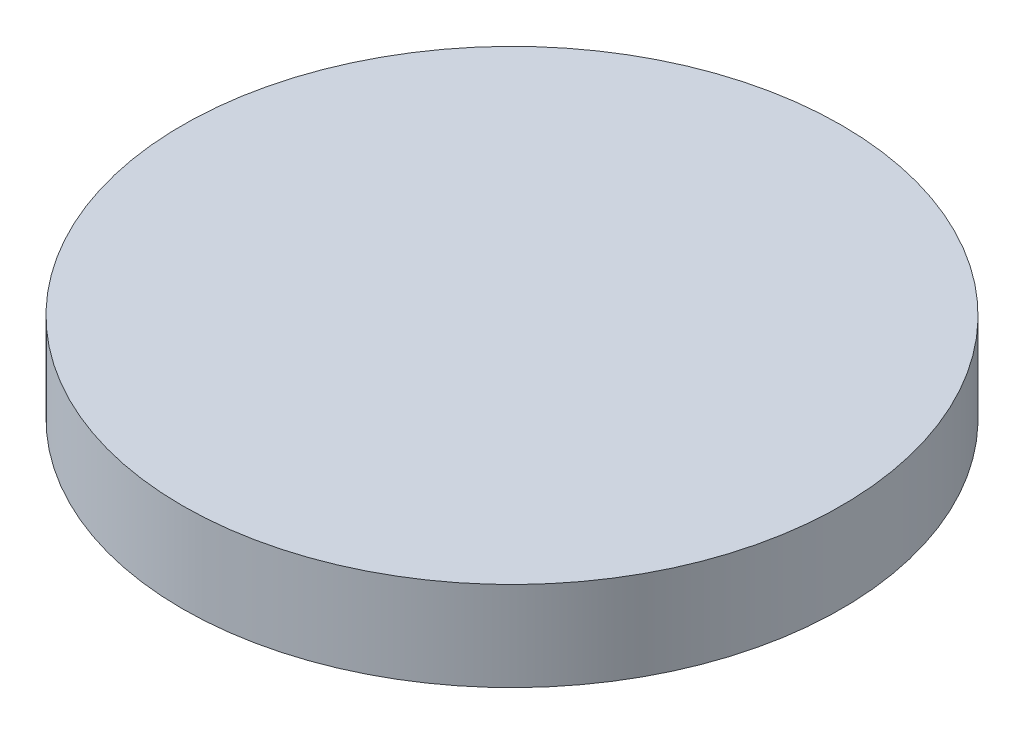
ISO-10303-21;
HEADER;
FILE_DESCRIPTION(('STEP AP214'),'2;1');
FILE_NAME('part.step','',(''),(''),'','','');
FILE_SCHEMA(('AUTOMOTIVE_DESIGN { 1 0 10303 214 1 1 1 1 }'));
ENDSEC;
DATA;
#1=APPLICATION_CONTEXT('core data for automotive mechanical design processes');
#2=APPLICATION_PROTOCOL_DEFINITION('international standard','automotive_design',2000,#1);
#3=PRODUCT_CONTEXT('',#1,'mechanical');
#4=PRODUCT('Part','Part','',(#3));
#5=PRODUCT_RELATED_PRODUCT_CATEGORY('part','',(#4));
#6=PRODUCT_DEFINITION_FORMATION('','',#4);
#7=PRODUCT_DEFINITION_CONTEXT('part definition',#1,'design');
#8=PRODUCT_DEFINITION('design','',#6,#7);
#9=PRODUCT_DEFINITION_SHAPE('','',#8);
#10=(LENGTH_UNIT() NAMED_UNIT(*) SI_UNIT(.MILLI.,.METRE.));
#11=(NAMED_UNIT(*) PLANE_ANGLE_UNIT() SI_UNIT($,.RADIAN.));
#12=(NAMED_UNIT(*) SI_UNIT($,.STERADIAN.) SOLID_ANGLE_UNIT());
#13=UNCERTAINTY_MEASURE_WITH_UNIT(LENGTH_MEASURE(1.E-05),#10,'distance_accuracy_value','');
#14=(GEOMETRIC_REPRESENTATION_CONTEXT(3) GLOBAL_UNCERTAINTY_ASSIGNED_CONTEXT((#13)) GLOBAL_UNIT_ASSIGNED_CONTEXT((#10,
#11,#12)) REPRESENTATION_CONTEXT('',''));
#15=CARTESIAN_POINT('',(0.,0.,0.));
#16=DIRECTION('',(0.,0.,1.));
#17=DIRECTION('',(1.,0.,0.));
#18=AXIS2_PLACEMENT_3D('',#15,#16,#17);
#19=CARTESIAN_POINT('',(0.,10.,0.));
#20=DIRECTION('',(0.,-1.,0.));
#21=DIRECTION('',(0.,0.,-1.));
#22=AXIS2_PLACEMENT_3D('',#19,#20,#21);
#23=CYLINDRICAL_SURFACE('',#22,36.89709041917);
#24=CARTESIAN_POINT('',(0.,10.,0.));
#25=DIRECTION('',(0.,1.,0.));
#26=DIRECTION('',(0.,0.,1.));
#27=AXIS2_PLACEMENT_3D('',#24,#25,#26);
#28=CIRCLE('',#27,36.89709041917);
#29=CARTESIAN_POINT('',(0.,10.,36.89709041917));
#30=VERTEX_POINT('',#29);
#31=EDGE_CURVE('E10',#30,#30,#28,.T.);
#32=ORIENTED_EDGE('',*,*,#31,.F.);
#33=EDGE_LOOP('',(#32));
#34=FACE_BOUND('',#33,.T.);
#35=CARTESIAN_POINT('',(0.,0.,0.));
#36=DIRECTION('',(0.,1.,0.));
#37=DIRECTION('',(0.,0.,1.));
#38=AXIS2_PLACEMENT_3D('',#35,#36,#37);
#39=CIRCLE('',#38,36.89709041917);
#40=CARTESIAN_POINT('',(0.,0.,36.89709041917));
#41=VERTEX_POINT('',#40);
#42=EDGE_CURVE('E34',#41,#41,#39,.T.);
#43=ORIENTED_EDGE('',*,*,#42,.T.);
#44=EDGE_LOOP('',(#43));
#45=FACE_BOUND('',#44,.T.);
#46=ADVANCED_FACE('F31',(#34,#45),#23,.T.);
#47=CARTESIAN_POINT('',(0.,10.,0.));
#48=DIRECTION('',(0.,1.,0.));
#49=DIRECTION('',(0.,0.,1.));
#50=AXIS2_PLACEMENT_3D('',#47,#48,#49);
#51=PLANE('',#50);
#52=ORIENTED_EDGE('',*,*,#31,.T.);
#53=EDGE_LOOP('',(#52));
#54=FACE_BOUND('',#53,.T.);
#55=ADVANCED_FACE('F62',(#54),#51,.T.);
#56=CARTESIAN_POINT('',(0.,0.,0.));
#57=DIRECTION('',(0.,1.,0.));
#58=DIRECTION('',(0.,0.,1.));
#59=AXIS2_PLACEMENT_3D('',#56,#57,#58);
#60=PLANE('',#59);
#61=CARTESIAN_POINT('',(0.,0.,0.));
#62=DIRECTION('',(0.,1.,0.));
#63=DIRECTION('',(0.,0.,1.));
#64=AXIS2_PLACEMENT_3D('',#61,#62,#63);
#65=CIRCLE('',#64,34.89709041917);
#66=CARTESIAN_POINT('',(0.,0.,34.89709041917));
#67=VERTEX_POINT('',#66);
#68=EDGE_CURVE('E43',#67,#67,#65,.T.);
#69=ORIENTED_EDGE('',*,*,#68,.T.);
#70=EDGE_LOOP('',(#69));
#71=FACE_BOUND('',#70,.T.);
#72=ORIENTED_EDGE('',*,*,#42,.F.);
#73=EDGE_LOOP('',(#72));
#74=FACE_BOUND('',#73,.T.);
#75=ADVANCED_FACE('F58',(#71,#74),#60,.F.);
#76=CARTESIAN_POINT('',(0.,10.,0.));
#77=DIRECTION('',(0.,-1.,0.));
#78=DIRECTION('',(0.,0.,-1.));
#79=AXIS2_PLACEMENT_3D('',#76,#77,#78);
#80=CYLINDRICAL_SURFACE('',#79,34.89709041917);
#81=CARTESIAN_POINT('',(0.,8.,0.));
#82=DIRECTION('',(0.,1.,0.));
#83=DIRECTION('',(0.,0.,1.));
#84=AXIS2_PLACEMENT_3D('',#81,#82,#83);
#85=CIRCLE('',#84,34.89709041917);
#86=CARTESIAN_POINT('',(0.,8.,34.89709041917));
#87=VERTEX_POINT('',#86);
#88=EDGE_CURVE('E41',#87,#87,#85,.T.);
#89=ORIENTED_EDGE('',*,*,#88,.T.);
#90=EDGE_LOOP('',(#89));
#91=FACE_BOUND('',#90,.T.);
#92=ORIENTED_EDGE('',*,*,#68,.F.);
#93=EDGE_LOOP('',(#92));
#94=FACE_BOUND('',#93,.T.);
#95=ADVANCED_FACE('F49',(#91,#94),#80,.F.);
#96=CARTESIAN_POINT('',(0.,8.,0.));
#97=DIRECTION('',(0.,1.,0.));
#98=DIRECTION('',(0.,0.,1.));
#99=AXIS2_PLACEMENT_3D('',#96,#97,#98);
#100=PLANE('',#99);
#101=ORIENTED_EDGE('',*,*,#88,.F.);
#102=EDGE_LOOP('',(#101));
#103=FACE_BOUND('',#102,.T.);
#104=ADVANCED_FACE('F52',(#103),#100,.F.);
#105=CLOSED_SHELL('',(#46,#55,#75,#95,#104));
#106=MANIFOLD_SOLID_BREP('B2',#105);
#107=ADVANCED_BREP_SHAPE_REPRESENTATION('',(#18,#106),#14);
#108=SHAPE_DEFINITION_REPRESENTATION(#9,#107);
ENDSEC;
END-ISO-10303-21;
